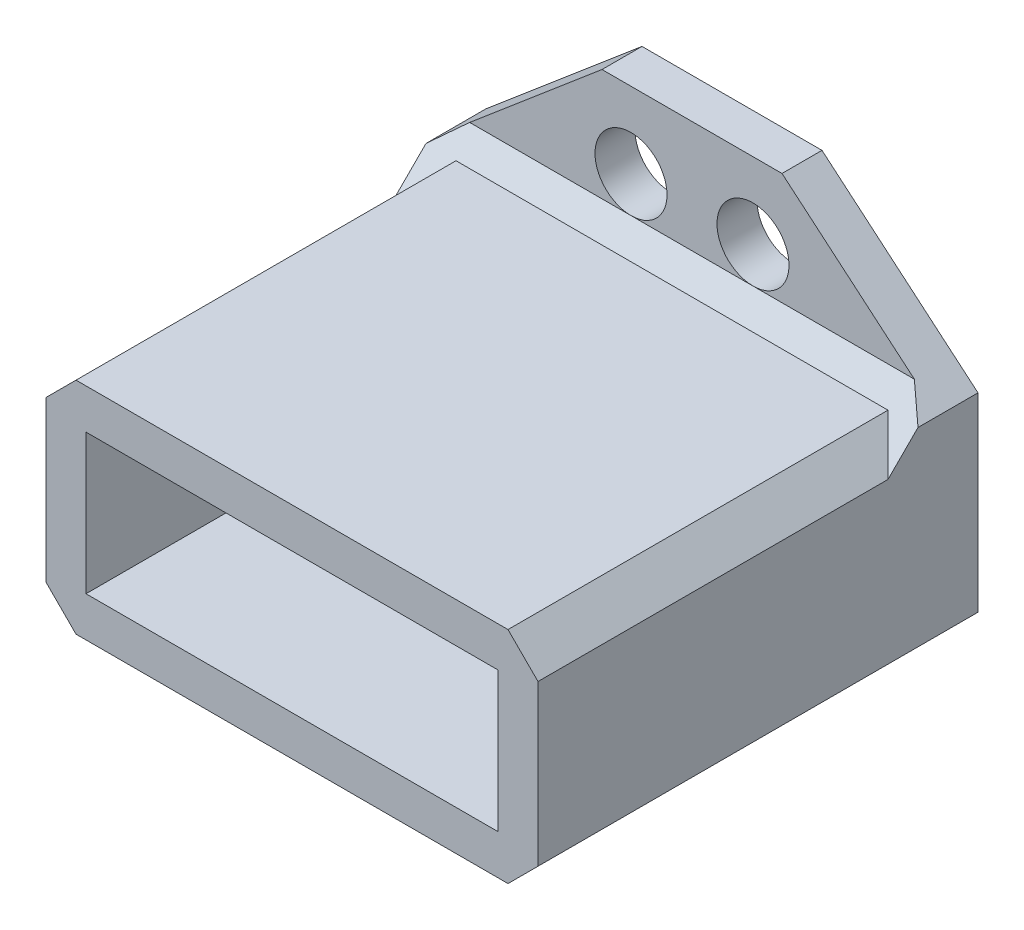
ISO-10303-21;
HEADER;
FILE_DESCRIPTION(('STEP AP214'),'2;1');
FILE_NAME('part.step','',(''),(''),'','','');
FILE_SCHEMA(('AUTOMOTIVE_DESIGN { 1 0 10303 214 1 1 1 1 }'));
ENDSEC;
DATA;
#1=APPLICATION_CONTEXT('core data for automotive mechanical design processes');
#2=APPLICATION_PROTOCOL_DEFINITION('international standard','automotive_design',2000,#1);
#3=PRODUCT_CONTEXT('',#1,'mechanical');
#4=PRODUCT('Part','Part','',(#3));
#5=PRODUCT_RELATED_PRODUCT_CATEGORY('part','',(#4));
#6=PRODUCT_DEFINITION_FORMATION('','',#4);
#7=PRODUCT_DEFINITION_CONTEXT('part definition',#1,'design');
#8=PRODUCT_DEFINITION('design','',#6,#7);
#9=PRODUCT_DEFINITION_SHAPE('','',#8);
#10=(LENGTH_UNIT() NAMED_UNIT(*) SI_UNIT(.MILLI.,.METRE.));
#11=(NAMED_UNIT(*) PLANE_ANGLE_UNIT() SI_UNIT($,.RADIAN.));
#12=(NAMED_UNIT(*) SI_UNIT($,.STERADIAN.) SOLID_ANGLE_UNIT());
#13=UNCERTAINTY_MEASURE_WITH_UNIT(LENGTH_MEASURE(1.E-05),#10,'distance_accuracy_value','');
#14=(GEOMETRIC_REPRESENTATION_CONTEXT(3) GLOBAL_UNCERTAINTY_ASSIGNED_CONTEXT((#13)) GLOBAL_UNIT_ASSIGNED_CONTEXT((#10,
#11,#12)) REPRESENTATION_CONTEXT('',''));
#15=CARTESIAN_POINT('',(0.,0.,0.));
#16=DIRECTION('',(0.,0.,1.));
#17=DIRECTION('',(1.,0.,0.));
#18=AXIS2_PLACEMENT_3D('',#15,#16,#17);
#19=CARTESIAN_POINT('',(-10.3,-3.5,10.));
#20=DIRECTION('',(0.,1.,0.));
#21=DIRECTION('',(-1.,0.,0.));
#22=AXIS2_PLACEMENT_3D('',#19,#20,#21);
#23=PLANE('',#22);
#24=DIRECTION('',(0.,0.,-1.));
#25=VECTOR('',#24,1.);
#26=CARTESIAN_POINT('',(10.3,-3.5,10.));
#27=LINE('',#26,#25);
#28=CARTESIAN_POINT('',(10.3,-3.5,10.));
#29=VERTEX_POINT('',#28);
#30=CARTESIAN_POINT('',(10.3,-3.5,-12.));
#31=VERTEX_POINT('',#30);
#32=EDGE_CURVE('E422',#29,#31,#27,.T.);
#33=ORIENTED_EDGE('',*,*,#32,.T.);
#34=DIRECTION('',(-1.,0.,0.));
#35=VECTOR('',#34,1.);
#36=CARTESIAN_POINT('',(10.3,-3.5,-12.));
#37=LINE('',#36,#35);
#38=CARTESIAN_POINT('',(-10.3,-3.5,-12.));
#39=VERTEX_POINT('',#38);
#40=EDGE_CURVE('E345',#31,#39,#37,.T.);
#41=ORIENTED_EDGE('',*,*,#40,.T.);
#42=DIRECTION('',(0.,0.,-1.));
#43=VECTOR('',#42,1.);
#44=CARTESIAN_POINT('',(-10.3,-3.5,10.));
#45=LINE('',#44,#43);
#46=CARTESIAN_POINT('',(-10.3,-3.5,10.));
#47=VERTEX_POINT('',#46);
#48=EDGE_CURVE('E425',#47,#39,#45,.T.);
#49=ORIENTED_EDGE('',*,*,#48,.F.);
#50=DIRECTION('',(1.,0.,0.));
#51=VECTOR('',#50,1.);
#52=CARTESIAN_POINT('',(-10.3,-3.5,10.));
#53=LINE('',#52,#51);
#54=EDGE_CURVE('E406',#47,#29,#53,.T.);
#55=ORIENTED_EDGE('',*,*,#54,.T.);
#56=EDGE_LOOP('',(#33,#41,#49,#55));
#57=FACE_BOUND('',#56,.T.);
#58=DIRECTION('',(1.,0.,0.));
#59=VECTOR('',#58,1.);
#60=CARTESIAN_POINT('',(-10.3,-3.5,-5.75));
#61=LINE('',#60,#59);
#62=CARTESIAN_POINT('',(-6.82679491924311,-3.5,-5.75));
#63=VERTEX_POINT('',#62);
#64=CARTESIAN_POINT('',(-3.17320520786901,-3.5,-5.75));
#65=VERTEX_POINT('',#64);
#66=EDGE_CURVE('E535',#63,#65,#61,.T.);
#67=ORIENTED_EDGE('',*,*,#66,.T.);
#68=DIRECTION('',(0.,0.,1.));
#69=VECTOR('',#68,1.);
#70=CARTESIAN_POINT('',(-3.17320520786901,-3.5,-3.75));
#71=LINE('',#70,#69);
#72=CARTESIAN_POINT('',(-3.17320520786901,-3.5,-0.749999999999999));
#73=VERTEX_POINT('',#72);
#74=EDGE_CURVE('E320',#65,#73,#71,.T.);
#75=ORIENTED_EDGE('',*,*,#74,.T.);
#76=DIRECTION('',(1.,0.,0.));
#77=VECTOR('',#76,1.);
#78=CARTESIAN_POINT('',(-6.82679491924311,-3.5,-0.749999999999999));
#79=LINE('',#78,#77);
#80=CARTESIAN_POINT('',(-6.82679491924311,-3.5,-0.749999999999999));
#81=VERTEX_POINT('',#80);
#82=EDGE_CURVE('E301',#81,#73,#79,.T.);
#83=ORIENTED_EDGE('',*,*,#82,.F.);
#84=DIRECTION('',(0.,0.,1.));
#85=VECTOR('',#84,1.);
#86=CARTESIAN_POINT('',(-6.82679491924311,-3.5,-3.75));
#87=LINE('',#86,#85);
#88=EDGE_CURVE('E297',#63,#81,#87,.T.);
#89=ORIENTED_EDGE('',*,*,#88,.F.);
#90=EDGE_LOOP('',(#67,#75,#83,#89));
#91=FACE_BOUND('',#90,.T.);
#92=DIRECTION('',(1.,0.,0.));
#93=VECTOR('',#92,1.);
#94=CARTESIAN_POINT('',(-10.3,-3.5,-5.75));
#95=LINE('',#94,#93);
#96=CARTESIAN_POINT('',(3.173205207869,-3.5,-5.75));
#97=VERTEX_POINT('',#96);
#98=CARTESIAN_POINT('',(6.826794792131,-3.5,-5.75));
#99=VERTEX_POINT('',#98);
#100=EDGE_CURVE('E539',#97,#99,#95,.T.);
#101=ORIENTED_EDGE('',*,*,#100,.T.);
#102=DIRECTION('',(0.,0.,1.));
#103=VECTOR('',#102,1.);
#104=CARTESIAN_POINT('',(6.826794792131,-3.5,-3.75));
#105=LINE('',#104,#103);
#106=CARTESIAN_POINT('',(6.826794792131,-3.5,-0.749999999999999));
#107=VERTEX_POINT('',#106);
#108=EDGE_CURVE('E991',#99,#107,#105,.T.);
#109=ORIENTED_EDGE('',*,*,#108,.T.);
#110=DIRECTION('',(1.,0.,0.));
#111=VECTOR('',#110,1.);
#112=CARTESIAN_POINT('',(3.173205207869,-3.5,-0.749999999999999));
#113=LINE('',#112,#111);
#114=CARTESIAN_POINT('',(3.173205207869,-3.5,-0.749999999999999));
#115=VERTEX_POINT('',#114);
#116=EDGE_CURVE('E267',#115,#107,#113,.T.);
#117=ORIENTED_EDGE('',*,*,#116,.F.);
#118=DIRECTION('',(0.,0.,1.));
#119=VECTOR('',#118,1.);
#120=CARTESIAN_POINT('',(3.173205207869,-3.5,-3.75));
#121=LINE('',#120,#119);
#122=EDGE_CURVE('E262',#97,#115,#121,.T.);
#123=ORIENTED_EDGE('',*,*,#122,.F.);
#124=EDGE_LOOP('',(#101,#109,#117,#123));
#125=FACE_BOUND('',#124,.T.);
#126=ADVANCED_FACE('F47',(#57,#91,#125),#23,.T.);
#127=CARTESIAN_POINT('',(-10.3,3.5,10.));
#128=DIRECTION('',(0.,-1.,0.));
#129=DIRECTION('',(0.,0.,-1.));
#130=AXIS2_PLACEMENT_3D('',#127,#128,#129);
#131=PLANE('',#130);
#132=DIRECTION('',(0.,0.,-1.));
#133=VECTOR('',#132,1.);
#134=CARTESIAN_POINT('',(-10.3,3.5,10.));
#135=LINE('',#134,#133);
#136=CARTESIAN_POINT('',(-10.3,3.5,10.));
#137=VERTEX_POINT('',#136);
#138=CARTESIAN_POINT('',(-10.3,3.5,-12.));
#139=VERTEX_POINT('',#138);
#140=EDGE_CURVE('E416',#137,#139,#135,.T.);
#141=ORIENTED_EDGE('',*,*,#140,.T.);
#142=DIRECTION('',(1.,0.,0.));
#143=VECTOR('',#142,1.);
#144=CARTESIAN_POINT('',(-10.3,3.5,-12.));
#145=LINE('',#144,#143);
#146=CARTESIAN_POINT('',(10.3,3.5,-12.));
#147=VERTEX_POINT('',#146);
#148=EDGE_CURVE('E353',#139,#147,#145,.T.);
#149=ORIENTED_EDGE('',*,*,#148,.T.);
#150=DIRECTION('',(0.,0.,-1.));
#151=VECTOR('',#150,1.);
#152=CARTESIAN_POINT('',(10.3,3.5,10.));
#153=LINE('',#152,#151);
#154=CARTESIAN_POINT('',(10.3,3.5,10.));
#155=VERTEX_POINT('',#154);
#156=EDGE_CURVE('E419',#155,#147,#153,.T.);
#157=ORIENTED_EDGE('',*,*,#156,.F.);
#158=DIRECTION('',(-1.,0.,0.));
#159=VECTOR('',#158,1.);
#160=CARTESIAN_POINT('',(-10.3,3.5,10.));
#161=LINE('',#160,#159);
#162=EDGE_CURVE('E413',#155,#137,#161,.T.);
#163=ORIENTED_EDGE('',*,*,#162,.T.);
#164=EDGE_LOOP('',(#141,#149,#157,#163));
#165=FACE_BOUND('',#164,.T.);
#166=DIRECTION('',(-1.,0.,0.));
#167=VECTOR('',#166,1.);
#168=CARTESIAN_POINT('',(-10.3,3.5,-5.75));
#169=LINE('',#168,#167);
#170=CARTESIAN_POINT('',(-3.17320520786901,3.5,-5.75));
#171=VERTEX_POINT('',#170);
#172=CARTESIAN_POINT('',(-6.82679491924311,3.5,-5.75));
#173=VERTEX_POINT('',#172);
#174=EDGE_CURVE('E523',#171,#173,#169,.T.);
#175=ORIENTED_EDGE('',*,*,#174,.T.);
#176=DIRECTION('',(0.,0.,1.));
#177=VECTOR('',#176,1.);
#178=CARTESIAN_POINT('',(-6.82679491924311,3.5,-3.75));
#179=LINE('',#178,#177);
#180=CARTESIAN_POINT('',(-6.82679491924311,3.5,-0.749999999999999));
#181=VERTEX_POINT('',#180);
#182=EDGE_CURVE('E312',#173,#181,#179,.T.);
#183=ORIENTED_EDGE('',*,*,#182,.T.);
#184=DIRECTION('',(-1.,0.,0.));
#185=VECTOR('',#184,1.);
#186=CARTESIAN_POINT('',(-6.82679491924311,3.5,-0.749999999999999));
#187=LINE('',#186,#185);
#188=CARTESIAN_POINT('',(-3.17320520786901,3.5,-0.749999999999999));
#189=VERTEX_POINT('',#188);
#190=EDGE_CURVE('E294',#189,#181,#187,.T.);
#191=ORIENTED_EDGE('',*,*,#190,.F.);
#192=DIRECTION('',(0.,0.,1.));
#193=VECTOR('',#192,1.);
#194=CARTESIAN_POINT('',(-3.17320520786901,3.5,-3.75));
#195=LINE('',#194,#193);
#196=EDGE_CURVE('E316',#171,#189,#195,.T.);
#197=ORIENTED_EDGE('',*,*,#196,.F.);
#198=EDGE_LOOP('',(#175,#183,#191,#197));
#199=FACE_BOUND('',#198,.T.);
#200=DIRECTION('',(-1.,0.,0.));
#201=VECTOR('',#200,1.);
#202=CARTESIAN_POINT('',(-10.3,3.5,-5.75));
#203=LINE('',#202,#201);
#204=CARTESIAN_POINT('',(6.826794792131,3.5,-5.75));
#205=VERTEX_POINT('',#204);
#206=CARTESIAN_POINT('',(3.173205207869,3.5,-5.75));
#207=VERTEX_POINT('',#206);
#208=EDGE_CURVE('E251',#205,#207,#203,.T.);
#209=ORIENTED_EDGE('',*,*,#208,.T.);
#210=DIRECTION('',(0.,0.,1.));
#211=VECTOR('',#210,1.);
#212=CARTESIAN_POINT('',(3.173205207869,3.5,-3.75));
#213=LINE('',#212,#211);
#214=CARTESIAN_POINT('',(3.173205207869,3.5,-0.749999999999999));
#215=VERTEX_POINT('',#214);
#216=EDGE_CURVE('E244',#207,#215,#213,.T.);
#217=ORIENTED_EDGE('',*,*,#216,.T.);
#218=DIRECTION('',(-1.,0.,0.));
#219=VECTOR('',#218,1.);
#220=CARTESIAN_POINT('',(3.173205207869,3.5,-0.749999999999999));
#221=LINE('',#220,#219);
#222=CARTESIAN_POINT('',(6.826794792131,3.5,-0.749999999999999));
#223=VERTEX_POINT('',#222);
#224=EDGE_CURVE('E248',#223,#215,#221,.T.);
#225=ORIENTED_EDGE('',*,*,#224,.F.);
#226=DIRECTION('',(0.,0.,1.));
#227=VECTOR('',#226,1.);
#228=CARTESIAN_POINT('',(6.826794792131,3.5,-3.75));
#229=LINE('',#228,#227);
#230=EDGE_CURVE('E255',#205,#223,#229,.T.);
#231=ORIENTED_EDGE('',*,*,#230,.F.);
#232=EDGE_LOOP('',(#209,#217,#225,#231));
#233=FACE_BOUND('',#232,.T.);
#234=ADVANCED_FACE('F246',(#165,#199,#233),#131,.T.);
#235=CARTESIAN_POINT('',(0.,0.,10.));
#236=DIRECTION('',(0.,0.,-1.));
#237=DIRECTION('',(-1.,0.,0.));
#238=AXIS2_PLACEMENT_3D('',#235,#236,#237);
#239=PLANE('',#238);
#240=DIRECTION('',(0.,-1.,0.));
#241=VECTOR('',#240,1.);
#242=CARTESIAN_POINT('',(-12.3,5.5,10.));
#243=LINE('',#242,#241);
#244=CARTESIAN_POINT('',(-12.3,3.99999999999999,10.));
#245=VERTEX_POINT('',#244);
#246=CARTESIAN_POINT('',(-12.3,-3.99999999999999,10.));
#247=VERTEX_POINT('',#246);
#248=EDGE_CURVE('E432',#245,#247,#243,.T.);
#249=ORIENTED_EDGE('',*,*,#248,.T.);
#250=DIRECTION('',(-0.707106781186548,0.707106781186548,0.));
#251=VECTOR('',#250,1.);
#252=CARTESIAN_POINT('',(-10.8,-5.5,10.));
#253=LINE('',#252,#251);
#254=CARTESIAN_POINT('',(-10.8,-5.5,10.));
#255=VERTEX_POINT('',#254);
#256=EDGE_CURVE('E496',#247,#255,#253,.F.);
#257=ORIENTED_EDGE('',*,*,#256,.T.);
#258=DIRECTION('',(1.,0.,0.));
#259=VECTOR('',#258,1.);
#260=CARTESIAN_POINT('',(-12.3,-5.5,10.));
#261=LINE('',#260,#259);
#262=CARTESIAN_POINT('',(10.8,-5.5,10.));
#263=VERTEX_POINT('',#262);
#264=EDGE_CURVE('E436',#255,#263,#261,.T.);
#265=ORIENTED_EDGE('',*,*,#264,.T.);
#266=DIRECTION('',(-0.707106781186548,-0.707106781186548,0.));
#267=VECTOR('',#266,1.);
#268=CARTESIAN_POINT('',(12.3,-3.99999999999999,10.));
#269=LINE('',#268,#267);
#270=CARTESIAN_POINT('',(12.3,-3.99999999999999,10.));
#271=VERTEX_POINT('',#270);
#272=EDGE_CURVE('E493',#263,#271,#269,.F.);
#273=ORIENTED_EDGE('',*,*,#272,.T.);
#274=DIRECTION('',(0.,1.,0.));
#275=VECTOR('',#274,1.);
#276=CARTESIAN_POINT('',(12.3,5.5,10.));
#277=LINE('',#276,#275);
#278=CARTESIAN_POINT('',(12.3,4.,10.));
#279=VERTEX_POINT('',#278);
#280=EDGE_CURVE('E440',#271,#279,#277,.T.);
#281=ORIENTED_EDGE('',*,*,#280,.T.);
#282=DIRECTION('',(0.707106781186547,-0.707106781186548,0.));
#283=VECTOR('',#282,1.);
#284=CARTESIAN_POINT('',(10.8,5.5,10.));
#285=LINE('',#284,#283);
#286=CARTESIAN_POINT('',(10.8,5.5,10.));
#287=VERTEX_POINT('',#286);
#288=EDGE_CURVE('E490',#279,#287,#285,.F.);
#289=ORIENTED_EDGE('',*,*,#288,.T.);
#290=DIRECTION('',(-1.,0.,0.));
#291=VECTOR('',#290,1.);
#292=CARTESIAN_POINT('',(-12.3,5.5,10.));
#293=LINE('',#292,#291);
#294=CARTESIAN_POINT('',(-10.8,5.5,10.));
#295=VERTEX_POINT('',#294);
#296=EDGE_CURVE('E428',#287,#295,#293,.T.);
#297=ORIENTED_EDGE('',*,*,#296,.T.);
#298=DIRECTION('',(0.707106781186548,0.707106781186548,0.));
#299=VECTOR('',#298,1.);
#300=CARTESIAN_POINT('',(-12.3,3.99999999999999,10.));
#301=LINE('',#300,#299);
#302=EDGE_CURVE('E487',#295,#245,#301,.F.);
#303=ORIENTED_EDGE('',*,*,#302,.T.);
#304=EDGE_LOOP('',(#249,#257,#265,#273,#281,#289,#297,#303));
#305=FACE_BOUND('',#304,.T.);
#306=DIRECTION('',(0.,-1.,0.));
#307=VECTOR('',#306,1.);
#308=CARTESIAN_POINT('',(-10.3,3.5,10.));
#309=LINE('',#308,#307);
#310=EDGE_CURVE('E403',#137,#47,#309,.T.);
#311=ORIENTED_EDGE('',*,*,#310,.F.);
#312=ORIENTED_EDGE('',*,*,#162,.F.);
#313=DIRECTION('',(0.,1.,0.));
#314=VECTOR('',#313,1.);
#315=CARTESIAN_POINT('',(10.3,3.5,10.));
#316=LINE('',#315,#314);
#317=EDGE_CURVE('E409',#29,#155,#316,.T.);
#318=ORIENTED_EDGE('',*,*,#317,.F.);
#319=ORIENTED_EDGE('',*,*,#54,.F.);
#320=EDGE_LOOP('',(#311,#312,#318,#319));
#321=FACE_BOUND('',#320,.T.);
#322=ADVANCED_FACE('F605',(#305,#321),#239,.F.);
#323=CARTESIAN_POINT('',(-12.3,5.5,10.));
#324=DIRECTION('',(0.,-1.,0.));
#325=DIRECTION('',(0.,0.,-1.));
#326=AXIS2_PLACEMENT_3D('',#323,#324,#325);
#327=PLANE('',#326);
#328=ORIENTED_EDGE('',*,*,#296,.F.);
#329=DIRECTION('',(0.,0.,-1.));
#330=VECTOR('',#329,1.);
#331=CARTESIAN_POINT('',(10.8,5.5,10.));
#332=LINE('',#331,#330);
#333=CARTESIAN_POINT('',(10.8,5.5,-8.99999999999999));
#334=VERTEX_POINT('',#333);
#335=EDGE_CURVE('E513',#287,#334,#332,.T.);
#336=ORIENTED_EDGE('',*,*,#335,.T.);
#337=DIRECTION('',(-1.,0.,0.));
#338=VECTOR('',#337,1.);
#339=CARTESIAN_POINT('',(-12.3,5.5,-8.99999999999999));
#340=LINE('',#339,#338);
#341=CARTESIAN_POINT('',(-10.8,5.5,-8.99999999999999));
#342=VERTEX_POINT('',#341);
#343=EDGE_CURVE('E444',#334,#342,#340,.T.);
#344=ORIENTED_EDGE('',*,*,#343,.T.);
#345=DIRECTION('',(0.,0.,1.));
#346=VECTOR('',#345,1.);
#347=CARTESIAN_POINT('',(-10.8,5.5,10.));
#348=LINE('',#347,#346);
#349=EDGE_CURVE('E510',#342,#295,#348,.T.);
#350=ORIENTED_EDGE('',*,*,#349,.T.);
#351=EDGE_LOOP('',(#328,#336,#344,#350));
#352=FACE_BOUND('',#351,.T.);
#353=ADVANCED_FACE('F618',(#352),#327,.F.);
#354=CARTESIAN_POINT('',(-12.3,5.5,10.));
#355=DIRECTION('',(1.,0.,0.));
#356=DIRECTION('',(0.,1.,0.));
#357=AXIS2_PLACEMENT_3D('',#354,#355,#356);
#358=PLANE('',#357);
#359=DIRECTION('',(0.,1.,0.));
#360=VECTOR('',#359,1.);
#361=CARTESIAN_POINT('',(-12.3,5.5,-12.));
#362=LINE('',#361,#360);
#363=CARTESIAN_POINT('',(-12.3,-3.99999999999999,-12.));
#364=VERTEX_POINT('',#363);
#365=CARTESIAN_POINT('',(-12.3,5.5,-12.));
#366=VERTEX_POINT('',#365);
#367=EDGE_CURVE('E362',#364,#366,#362,.T.);
#368=ORIENTED_EDGE('',*,*,#367,.F.);
#369=DIRECTION('',(0.,0.,1.));
#370=VECTOR('',#369,1.);
#371=CARTESIAN_POINT('',(-12.3,-3.99999999999999,10.));
#372=LINE('',#371,#370);
#373=EDGE_CURVE('E484',#364,#247,#372,.T.);
#374=ORIENTED_EDGE('',*,*,#373,.T.);
#375=ORIENTED_EDGE('',*,*,#248,.F.);
#376=DIRECTION('',(0.,0.,-1.));
#377=VECTOR('',#376,1.);
#378=CARTESIAN_POINT('',(-12.3,3.99999999999999,10.));
#379=LINE('',#378,#377);
#380=CARTESIAN_POINT('',(-12.3,3.99999999999999,-7.49999999999997));
#381=VERTEX_POINT('',#380);
#382=EDGE_CURVE('E480',#245,#381,#379,.T.);
#383=ORIENTED_EDGE('',*,*,#382,.T.);
#384=DIRECTION('',(0.,0.707106781186544,-0.707106781186551));
#385=VECTOR('',#384,1.);
#386=CARTESIAN_POINT('',(-12.3,-3.99999999999999,0.500000000000106));
#387=LINE('',#386,#385);
#388=CARTESIAN_POINT('',(-12.3,5.5,-8.99999999999999));
#389=VERTEX_POINT('',#388);
#390=EDGE_CURVE('E477',#381,#389,#387,.T.);
#391=ORIENTED_EDGE('',*,*,#390,.T.);
#392=DIRECTION('',(0.,0.,1.));
#393=VECTOR('',#392,1.);
#394=CARTESIAN_POINT('',(-12.3,5.5,-12.));
#395=LINE('',#394,#393);
#396=EDGE_CURVE('E399',#366,#389,#395,.T.);
#397=ORIENTED_EDGE('',*,*,#396,.F.);
#398=EDGE_LOOP('',(#368,#374,#375,#383,#391,#397));
#399=FACE_BOUND('',#398,.T.);
#400=ADVANCED_FACE('F626',(#399),#358,.F.);
#401=CARTESIAN_POINT('',(-12.3,-5.5,10.));
#402=DIRECTION('',(0.,1.,0.));
#403=DIRECTION('',(0.,0.,1.));
#404=AXIS2_PLACEMENT_3D('',#401,#402,#403);
#405=PLANE('',#404);
#406=ORIENTED_EDGE('',*,*,#264,.F.);
#407=DIRECTION('',(0.,0.,-1.));
#408=VECTOR('',#407,1.);
#409=CARTESIAN_POINT('',(-10.8,-5.5,10.));
#410=LINE('',#409,#408);
#411=CARTESIAN_POINT('',(-10.8,-5.5,-12.));
#412=VERTEX_POINT('',#411);
#413=EDGE_CURVE('E467',#255,#412,#410,.T.);
#414=ORIENTED_EDGE('',*,*,#413,.T.);
#415=DIRECTION('',(-1.,0.,0.));
#416=VECTOR('',#415,1.);
#417=CARTESIAN_POINT('',(-12.3,-5.5,-12.));
#418=LINE('',#417,#416);
#419=CARTESIAN_POINT('',(10.8,-5.5,-12.));
#420=VERTEX_POINT('',#419);
#421=EDGE_CURVE('E358',#420,#412,#418,.T.);
#422=ORIENTED_EDGE('',*,*,#421,.F.);
#423=DIRECTION('',(0.,0.,1.));
#424=VECTOR('',#423,1.);
#425=CARTESIAN_POINT('',(10.8,-5.5,10.));
#426=LINE('',#425,#424);
#427=EDGE_CURVE('E464',#420,#263,#426,.T.);
#428=ORIENTED_EDGE('',*,*,#427,.T.);
#429=EDGE_LOOP('',(#406,#414,#422,#428));
#430=FACE_BOUND('',#429,.T.);
#431=ADVANCED_FACE('F622',(#430),#405,.F.);
#432=CARTESIAN_POINT('',(12.3,5.5,10.));
#433=DIRECTION('',(-1.,0.,0.));
#434=DIRECTION('',(0.,-1.,0.));
#435=AXIS2_PLACEMENT_3D('',#432,#433,#434);
#436=PLANE('',#435);
#437=ORIENTED_EDGE('',*,*,#280,.F.);
#438=DIRECTION('',(0.,0.,-1.));
#439=VECTOR('',#438,1.);
#440=CARTESIAN_POINT('',(12.3,-3.99999999999999,10.));
#441=LINE('',#440,#439);
#442=CARTESIAN_POINT('',(12.3,-3.99999999999999,-12.));
#443=VERTEX_POINT('',#442);
#444=EDGE_CURVE('E506',#271,#443,#441,.T.);
#445=ORIENTED_EDGE('',*,*,#444,.T.);
#446=DIRECTION('',(0.,-1.,0.));
#447=VECTOR('',#446,1.);
#448=CARTESIAN_POINT('',(12.3,-5.5,-12.));
#449=LINE('',#448,#447);
#450=CARTESIAN_POINT('',(12.3,5.5,-12.));
#451=VERTEX_POINT('',#450);
#452=EDGE_CURVE('E375',#451,#443,#449,.T.);
#453=ORIENTED_EDGE('',*,*,#452,.F.);
#454=DIRECTION('',(0.,0.,1.));
#455=VECTOR('',#454,1.);
#456=CARTESIAN_POINT('',(12.3,5.5,-12.));
#457=LINE('',#456,#455);
#458=CARTESIAN_POINT('',(12.3,5.5,-8.99999999999999));
#459=VERTEX_POINT('',#458);
#460=EDGE_CURVE('E379',#451,#459,#457,.T.);
#461=ORIENTED_EDGE('',*,*,#460,.T.);
#462=DIRECTION('',(0.,-0.707106781186544,0.707106781186551));
#463=VECTOR('',#462,1.);
#464=CARTESIAN_POINT('',(12.3,-3.99999999999999,0.500000000000106));
#465=LINE('',#464,#463);
#466=CARTESIAN_POINT('',(12.3,4.,-7.49999999999997));
#467=VERTEX_POINT('',#466);
#468=EDGE_CURVE('E502',#459,#467,#465,.T.);
#469=ORIENTED_EDGE('',*,*,#468,.T.);
#470=DIRECTION('',(0.,0.,1.));
#471=VECTOR('',#470,1.);
#472=CARTESIAN_POINT('',(12.3,4.,10.));
#473=LINE('',#472,#471);
#474=EDGE_CURVE('E499',#467,#279,#473,.T.);
#475=ORIENTED_EDGE('',*,*,#474,.T.);
#476=EDGE_LOOP('',(#437,#445,#453,#461,#469,#475));
#477=FACE_BOUND('',#476,.T.);
#478=ADVANCED_FACE('F614',(#477),#436,.F.);
#479=CARTESIAN_POINT('',(-10.3,3.5,10.));
#480=DIRECTION('',(1.,0.,0.));
#481=DIRECTION('',(0.,0.,-1.));
#482=AXIS2_PLACEMENT_3D('',#479,#480,#481);
#483=PLANE('',#482);
#484=ORIENTED_EDGE('',*,*,#48,.T.);
#485=DIRECTION('',(0.,1.,0.));
#486=VECTOR('',#485,1.);
#487=CARTESIAN_POINT('',(-10.3,-3.5,-12.));
#488=LINE('',#487,#486);
#489=EDGE_CURVE('E349',#39,#139,#488,.T.);
#490=ORIENTED_EDGE('',*,*,#489,.T.);
#491=ORIENTED_EDGE('',*,*,#140,.F.);
#492=ORIENTED_EDGE('',*,*,#310,.T.);
#493=EDGE_LOOP('',(#484,#490,#491,#492));
#494=FACE_BOUND('',#493,.T.);
#495=ADVANCED_FACE('F611',(#494),#483,.T.);
#496=CARTESIAN_POINT('',(10.3,3.5,10.));
#497=DIRECTION('',(-1.,0.,0.));
#498=DIRECTION('',(0.,0.,1.));
#499=AXIS2_PLACEMENT_3D('',#496,#497,#498);
#500=PLANE('',#499);
#501=ORIENTED_EDGE('',*,*,#156,.T.);
#502=DIRECTION('',(0.,-1.,0.));
#503=VECTOR('',#502,1.);
#504=CARTESIAN_POINT('',(10.3,3.5,-12.));
#505=LINE('',#504,#503);
#506=EDGE_CURVE('E338',#147,#31,#505,.T.);
#507=ORIENTED_EDGE('',*,*,#506,.T.);
#508=ORIENTED_EDGE('',*,*,#32,.F.);
#509=ORIENTED_EDGE('',*,*,#317,.T.);
#510=EDGE_LOOP('',(#501,#507,#508,#509));
#511=FACE_BOUND('',#510,.T.);
#512=ADVANCED_FACE('F610',(#511),#500,.T.);
#513=CARTESIAN_POINT('',(0.,0.,-10.));
#514=DIRECTION('',(0.,0.,1.));
#515=DIRECTION('',(1.,0.,0.));
#516=AXIS2_PLACEMENT_3D('',#513,#514,#515);
#517=PLANE('',#516);
#518=DIRECTION('',(0.763386285369115,0.645942241466174,0.));
#519=VECTOR('',#518,1.);
#520=CARTESIAN_POINT('',(-12.3,5.5,-10.));
#521=LINE('',#520,#519);
#522=CARTESIAN_POINT('',(-11.1181818181818,6.5,-10.));
#523=VERTEX_POINT('',#522);
#524=CARTESIAN_POINT('',(-4.5,12.1,-10.));
#525=VERTEX_POINT('',#524);
#526=EDGE_CURVE('E357',#523,#525,#521,.T.);
#527=ORIENTED_EDGE('',*,*,#526,.F.);
#528=DIRECTION('',(1.,0.,0.));
#529=VECTOR('',#528,1.);
#530=CARTESIAN_POINT('',(0.,6.5,-10.));
#531=LINE('',#530,#529);
#532=CARTESIAN_POINT('',(-3.05,6.5,-10.));
#533=VERTEX_POINT('',#532);
#534=EDGE_CURVE('E454',#523,#533,#531,.T.);
#535=ORIENTED_EDGE('',*,*,#534,.T.);
#536=CARTESIAN_POINT('',(-3.05,8.3,-10.));
#537=DIRECTION('',(0.,0.,-1.));
#538=DIRECTION('',(1.,0.,0.));
#539=AXIS2_PLACEMENT_3D('',#536,#537,#538);
#540=CIRCLE('',#539,1.8);
#541=EDGE_CURVE('E315',#533,#533,#540,.T.);
#542=ORIENTED_EDGE('',*,*,#541,.T.);
#543=DIRECTION('',(1.,0.,0.));
#544=VECTOR('',#543,1.);
#545=CARTESIAN_POINT('',(0.,6.5,-10.));
#546=LINE('',#545,#544);
#547=CARTESIAN_POINT('',(3.05,6.5,-10.));
#548=VERTEX_POINT('',#547);
#549=EDGE_CURVE('E451',#533,#548,#546,.T.);
#550=ORIENTED_EDGE('',*,*,#549,.T.);
#551=CARTESIAN_POINT('',(3.05,8.3,-10.));
#552=DIRECTION('',(0.,0.,-1.));
#553=DIRECTION('',(-1.,0.,0.));
#554=AXIS2_PLACEMENT_3D('',#551,#552,#553);
#555=CIRCLE('',#554,1.8);
#556=EDGE_CURVE('E330',#548,#548,#555,.T.);
#557=ORIENTED_EDGE('',*,*,#556,.T.);
#558=DIRECTION('',(1.,0.,0.));
#559=VECTOR('',#558,1.);
#560=CARTESIAN_POINT('',(0.,6.5,-10.));
#561=LINE('',#560,#559);
#562=CARTESIAN_POINT('',(11.1181818181818,6.5,-10.));
#563=VERTEX_POINT('',#562);
#564=EDGE_CURVE('E448',#548,#563,#561,.T.);
#565=ORIENTED_EDGE('',*,*,#564,.T.);
#566=DIRECTION('',(0.763386285369115,-0.645942241466174,0.));
#567=VECTOR('',#566,1.);
#568=CARTESIAN_POINT('',(4.5,12.1,-10.));
#569=LINE('',#568,#567);
#570=CARTESIAN_POINT('',(4.5,12.1,-10.));
#571=VERTEX_POINT('',#570);
#572=EDGE_CURVE('E363',#571,#563,#569,.T.);
#573=ORIENTED_EDGE('',*,*,#572,.F.);
#574=DIRECTION('',(1.,0.,0.));
#575=VECTOR('',#574,1.);
#576=CARTESIAN_POINT('',(-4.5,12.1,-10.));
#577=LINE('',#576,#575);
#578=EDGE_CURVE('E382',#525,#571,#577,.T.);
#579=ORIENTED_EDGE('',*,*,#578,.F.);
#580=EDGE_LOOP('',(#527,#535,#542,#550,#557,#565,#573,#579));
#581=FACE_BOUND('',#580,.T.);
#582=ADVANCED_FACE('F864',(#581),#517,.T.);
#583=CARTESIAN_POINT('',(0.,0.,-12.));
#584=DIRECTION('',(0.,0.,1.));
#585=DIRECTION('',(1.,0.,0.));
#586=AXIS2_PLACEMENT_3D('',#583,#584,#585);
#587=PLANE('',#586);
#588=ORIENTED_EDGE('',*,*,#421,.T.);
#589=DIRECTION('',(0.707106781186548,-0.707106781186548,0.));
#590=VECTOR('',#589,1.);
#591=CARTESIAN_POINT('',(-10.8,-5.5,-12.));
#592=LINE('',#591,#590);
#593=EDGE_CURVE('E474',#412,#364,#592,.F.);
#594=ORIENTED_EDGE('',*,*,#593,.T.);
#595=ORIENTED_EDGE('',*,*,#367,.T.);
#596=DIRECTION('',(0.763386285369115,0.645942241466174,0.));
#597=VECTOR('',#596,1.);
#598=CARTESIAN_POINT('',(-12.3,5.5,-12.));
#599=LINE('',#598,#597);
#600=CARTESIAN_POINT('',(-4.5,12.1,-12.));
#601=VERTEX_POINT('',#600);
#602=EDGE_CURVE('E366',#366,#601,#599,.T.);
#603=ORIENTED_EDGE('',*,*,#602,.T.);
#604=DIRECTION('',(1.,0.,0.));
#605=VECTOR('',#604,1.);
#606=CARTESIAN_POINT('',(-4.5,12.1,-12.));
#607=LINE('',#606,#605);
#608=CARTESIAN_POINT('',(4.5,12.1,-12.));
#609=VERTEX_POINT('',#608);
#610=EDGE_CURVE('E369',#601,#609,#607,.T.);
#611=ORIENTED_EDGE('',*,*,#610,.T.);
#612=DIRECTION('',(0.763386285369115,-0.645942241466174,0.));
#613=VECTOR('',#612,1.);
#614=CARTESIAN_POINT('',(4.5,12.1,-12.));
#615=LINE('',#614,#613);
#616=EDGE_CURVE('E372',#609,#451,#615,.T.);
#617=ORIENTED_EDGE('',*,*,#616,.T.);
#618=ORIENTED_EDGE('',*,*,#452,.T.);
#619=DIRECTION('',(0.707106781186548,0.707106781186548,0.));
#620=VECTOR('',#619,1.);
#621=CARTESIAN_POINT('',(12.3,-3.99999999999999,-12.));
#622=LINE('',#621,#620);
#623=EDGE_CURVE('E471',#443,#420,#622,.F.);
#624=ORIENTED_EDGE('',*,*,#623,.T.);
#625=EDGE_LOOP('',(#588,#594,#595,#603,#611,#617,#618,#624));
#626=FACE_BOUND('',#625,.T.);
#627=ORIENTED_EDGE('',*,*,#506,.F.);
#628=ORIENTED_EDGE('',*,*,#148,.F.);
#629=ORIENTED_EDGE('',*,*,#489,.F.);
#630=ORIENTED_EDGE('',*,*,#40,.F.);
#631=EDGE_LOOP('',(#627,#628,#629,#630));
#632=FACE_BOUND('',#631,.T.);
#633=CARTESIAN_POINT('',(3.05,8.3,-12.));
#634=DIRECTION('',(0.,0.,-1.));
#635=DIRECTION('',(-1.,0.,0.));
#636=AXIS2_PLACEMENT_3D('',#633,#634,#635);
#637=CIRCLE('',#636,1.8);
#638=CARTESIAN_POINT('',(1.25,8.3,-12.));
#639=VERTEX_POINT('',#638);
#640=EDGE_CURVE('E334',#639,#639,#637,.T.);
#641=ORIENTED_EDGE('',*,*,#640,.F.);
#642=EDGE_LOOP('',(#641));
#643=FACE_BOUND('',#642,.T.);
#644=CARTESIAN_POINT('',(-3.05,8.3,-12.));
#645=DIRECTION('',(0.,0.,-1.));
#646=DIRECTION('',(1.,0.,0.));
#647=AXIS2_PLACEMENT_3D('',#644,#645,#646);
#648=CIRCLE('',#647,1.8);
#649=CARTESIAN_POINT('',(-1.25,8.3,-12.));
#650=VERTEX_POINT('',#649);
#651=EDGE_CURVE('E326',#650,#650,#648,.T.);
#652=ORIENTED_EDGE('',*,*,#651,.F.);
#653=EDGE_LOOP('',(#652));
#654=FACE_BOUND('',#653,.T.);
#655=ADVANCED_FACE('F855',(#626,#632,#643,#654),#587,.F.);
#656=CARTESIAN_POINT('',(-12.3,5.5,-12.));
#657=DIRECTION('',(0.645942241466174,-0.763386285369115,0.));
#658=DIRECTION('',(0.763386285369115,0.645942241466174,0.));
#659=AXIS2_PLACEMENT_3D('',#656,#657,#658);
#660=PLANE('',#659);
#661=ORIENTED_EDGE('',*,*,#396,.T.);
#662=DIRECTION('',(0.641242710767085,0.542589986033687,-0.542589986033693));
#663=VECTOR('',#662,1.);
#664=CARTESIAN_POINT('',(-11.256204379562,6.38321167883212,-9.88321167883212));
#665=LINE('',#664,#663);
#666=EDGE_CURVE('E457',#389,#523,#665,.T.);
#667=ORIENTED_EDGE('',*,*,#666,.T.);
#668=ORIENTED_EDGE('',*,*,#526,.T.);
#669=DIRECTION('',(0.,0.,1.));
#670=VECTOR('',#669,1.);
#671=CARTESIAN_POINT('',(-4.5,12.1,-12.));
#672=LINE('',#671,#670);
#673=EDGE_CURVE('E395',#601,#525,#672,.T.);
#674=ORIENTED_EDGE('',*,*,#673,.F.);
#675=ORIENTED_EDGE('',*,*,#602,.F.);
#676=EDGE_LOOP('',(#661,#667,#668,#674,#675));
#677=FACE_BOUND('',#676,.T.);
#678=ADVANCED_FACE('F844',(#677),#660,.F.);
#679=CARTESIAN_POINT('',(-4.5,12.1,-12.));
#680=DIRECTION('',(0.,-1.,0.));
#681=DIRECTION('',(0.,0.,-1.));
#682=AXIS2_PLACEMENT_3D('',#679,#680,#681);
#683=PLANE('',#682);
#684=ORIENTED_EDGE('',*,*,#578,.T.);
#685=DIRECTION('',(0.,0.,1.));
#686=VECTOR('',#685,1.);
#687=CARTESIAN_POINT('',(4.5,12.1,-12.));
#688=LINE('',#687,#686);
#689=EDGE_CURVE('E391',#609,#571,#688,.T.);
#690=ORIENTED_EDGE('',*,*,#689,.F.);
#691=ORIENTED_EDGE('',*,*,#610,.F.);
#692=ORIENTED_EDGE('',*,*,#673,.T.);
#693=EDGE_LOOP('',(#684,#690,#691,#692));
#694=FACE_BOUND('',#693,.T.);
#695=ADVANCED_FACE('F833',(#694),#683,.F.);
#696=CARTESIAN_POINT('',(4.5,12.1,-12.));
#697=DIRECTION('',(-0.645942241466174,-0.763386285369115,0.));
#698=DIRECTION('',(0.763386285369115,-0.645942241466174,0.));
#699=AXIS2_PLACEMENT_3D('',#696,#697,#698);
#700=PLANE('',#699);
#701=ORIENTED_EDGE('',*,*,#572,.T.);
#702=DIRECTION('',(0.641242710767085,-0.542589986033687,0.542589986033693));
#703=VECTOR('',#702,1.);
#704=CARTESIAN_POINT('',(5.75255474452557,11.0401459854014,-14.5401459854015));
#705=LINE('',#704,#703);
#706=EDGE_CURVE('E460',#563,#459,#705,.T.);
#707=ORIENTED_EDGE('',*,*,#706,.T.);
#708=ORIENTED_EDGE('',*,*,#460,.F.);
#709=ORIENTED_EDGE('',*,*,#616,.F.);
#710=ORIENTED_EDGE('',*,*,#689,.T.);
#711=EDGE_LOOP('',(#701,#707,#708,#709,#710));
#712=FACE_BOUND('',#711,.T.);
#713=ADVANCED_FACE('F823',(#712),#700,.F.);
#714=CARTESIAN_POINT('',(3.05,8.3,-12.));
#715=DIRECTION('',(0.,0.,1.));
#716=DIRECTION('',(1.,0.,0.));
#717=AXIS2_PLACEMENT_3D('',#714,#715,#716);
#718=CYLINDRICAL_SURFACE('',#717,1.8);
#719=ORIENTED_EDGE('',*,*,#640,.T.);
#720=EDGE_LOOP('',(#719));
#721=FACE_BOUND('',#720,.T.);
#722=ORIENTED_EDGE('',*,*,#556,.F.);
#723=EDGE_LOOP('',(#722));
#724=FACE_BOUND('',#723,.T.);
#725=ADVANCED_FACE('F813',(#721,#724),#718,.F.);
#726=CARTESIAN_POINT('',(-3.05,8.3,-12.));
#727=DIRECTION('',(0.,0.,1.));
#728=DIRECTION('',(1.,0.,0.));
#729=AXIS2_PLACEMENT_3D('',#726,#727,#728);
#730=CYLINDRICAL_SURFACE('',#729,1.8);
#731=ORIENTED_EDGE('',*,*,#651,.T.);
#732=EDGE_LOOP('',(#731));
#733=FACE_BOUND('',#732,.T.);
#734=ORIENTED_EDGE('',*,*,#541,.F.);
#735=EDGE_LOOP('',(#734));
#736=FACE_BOUND('',#735,.T.);
#737=ADVANCED_FACE('F642',(#733,#736),#730,.F.);
#738=CARTESIAN_POINT('',(-12.3,5.5,-8.99999999999999));
#739=DIRECTION('',(0.,-0.707106781186551,-0.707106781186544));
#740=DIRECTION('',(-1.,0.,0.));
#741=AXIS2_PLACEMENT_3D('',#738,#739,#740);
#742=PLANE('',#741);
#743=ORIENTED_EDGE('',*,*,#549,.F.);
#744=ORIENTED_EDGE('',*,*,#534,.F.);
#745=ORIENTED_EDGE('',*,*,#666,.F.);
#746=ORIENTED_EDGE('',*,*,#390,.F.);
#747=DIRECTION('',(-0.577350269189624,-0.577350269189624,0.57735026918963));
#748=VECTOR('',#747,1.);
#749=CARTESIAN_POINT('',(-11.3,5.,-8.49999999999998));
#750=LINE('',#749,#748);
#751=EDGE_CURVE('E520',#381,#342,#750,.F.);
#752=ORIENTED_EDGE('',*,*,#751,.T.);
#753=ORIENTED_EDGE('',*,*,#343,.F.);
#754=DIRECTION('',(-0.577350269189623,0.577350269189624,-0.57735026918963));
#755=VECTOR('',#754,1.);
#756=CARTESIAN_POINT('',(3.10000000000007,13.1999999999999,-16.7));
#757=LINE('',#756,#755);
#758=EDGE_CURVE('E517',#334,#467,#757,.F.);
#759=ORIENTED_EDGE('',*,*,#758,.T.);
#760=ORIENTED_EDGE('',*,*,#468,.F.);
#761=ORIENTED_EDGE('',*,*,#706,.F.);
#762=ORIENTED_EDGE('',*,*,#564,.F.);
#763=EDGE_LOOP('',(#743,#744,#745,#746,#752,#753,#759,#760,#761,#762));
#764=FACE_BOUND('',#763,.T.);
#765=ADVANCED_FACE('F635',(#764),#742,.F.);
#766=CARTESIAN_POINT('',(-10.8,-5.5,10.));
#767=DIRECTION('',(0.707106781186547,0.707106781186547,0.));
#768=DIRECTION('',(0.,0.,-1.));
#769=AXIS2_PLACEMENT_3D('',#766,#767,#768);
#770=PLANE('',#769);
#771=ORIENTED_EDGE('',*,*,#256,.F.);
#772=ORIENTED_EDGE('',*,*,#373,.F.);
#773=ORIENTED_EDGE('',*,*,#593,.F.);
#774=ORIENTED_EDGE('',*,*,#413,.F.);
#775=EDGE_LOOP('',(#771,#772,#773,#774));
#776=FACE_BOUND('',#775,.T.);
#777=ADVANCED_FACE('F641',(#776),#770,.F.);
#778=CARTESIAN_POINT('',(12.3,-3.99999999999999,10.));
#779=DIRECTION('',(-0.707106781186547,0.707106781186547,0.));
#780=DIRECTION('',(0.,0.,-1.));
#781=AXIS2_PLACEMENT_3D('',#778,#779,#780);
#782=PLANE('',#781);
#783=ORIENTED_EDGE('',*,*,#272,.F.);
#784=ORIENTED_EDGE('',*,*,#427,.F.);
#785=ORIENTED_EDGE('',*,*,#623,.F.);
#786=ORIENTED_EDGE('',*,*,#444,.F.);
#787=EDGE_LOOP('',(#783,#784,#785,#786));
#788=FACE_BOUND('',#787,.T.);
#789=ADVANCED_FACE('F649',(#788),#782,.F.);
#790=CARTESIAN_POINT('',(10.8,5.5,10.));
#791=DIRECTION('',(-0.707106781186548,-0.707106781186547,0.));
#792=DIRECTION('',(0.,0.,-1.));
#793=AXIS2_PLACEMENT_3D('',#790,#791,#792);
#794=PLANE('',#793);
#795=ORIENTED_EDGE('',*,*,#288,.F.);
#796=ORIENTED_EDGE('',*,*,#474,.F.);
#797=ORIENTED_EDGE('',*,*,#758,.F.);
#798=ORIENTED_EDGE('',*,*,#335,.F.);
#799=EDGE_LOOP('',(#795,#796,#797,#798));
#800=FACE_BOUND('',#799,.T.);
#801=ADVANCED_FACE('F656',(#800),#794,.F.);
#802=CARTESIAN_POINT('',(-12.3,3.99999999999999,10.));
#803=DIRECTION('',(0.707106781186547,-0.707106781186547,0.));
#804=DIRECTION('',(0.,0.,-1.));
#805=AXIS2_PLACEMENT_3D('',#802,#803,#804);
#806=PLANE('',#805);
#807=ORIENTED_EDGE('',*,*,#302,.F.);
#808=ORIENTED_EDGE('',*,*,#349,.F.);
#809=ORIENTED_EDGE('',*,*,#751,.F.);
#810=ORIENTED_EDGE('',*,*,#382,.F.);
#811=EDGE_LOOP('',(#807,#808,#809,#810));
#812=FACE_BOUND('',#811,.T.);
#813=ADVANCED_FACE('F663',(#812),#806,.F.);
#814=CARTESIAN_POINT('',(-6.82679491924311,3.5,-3.75));
#815=DIRECTION('',(-1.,0.,0.));
#816=DIRECTION('',(0.,-1.,0.));
#817=AXIS2_PLACEMENT_3D('',#814,#815,#816);
#818=PLANE('',#817);
#819=DIRECTION('',(0.,-1.,0.));
#820=VECTOR('',#819,1.);
#821=CARTESIAN_POINT('',(-6.82679491924311,3.5,-0.749999999999999));
#822=LINE('',#821,#820);
#823=EDGE_CURVE('E266',#181,#81,#822,.T.);
#824=ORIENTED_EDGE('',*,*,#823,.F.);
#825=ORIENTED_EDGE('',*,*,#182,.F.);
#826=CARTESIAN_POINT('',(-6.82679491924311,1.5,-5.75));
#827=DIRECTION('',(-1.,0.,0.));
#828=DIRECTION('',(0.,-1.,0.));
#829=AXIS2_PLACEMENT_3D('',#826,#827,#828);
#830=CIRCLE('',#829,2.);
#831=CARTESIAN_POINT('',(-6.82679491924311,1.5,-3.75));
#832=VERTEX_POINT('',#831);
#833=EDGE_CURVE('E561',#173,#832,#830,.F.);
#834=ORIENTED_EDGE('',*,*,#833,.T.);
#835=DIRECTION('',(0.,-1.,0.));
#836=VECTOR('',#835,1.);
#837=CARTESIAN_POINT('',(-6.82679491924311,3.5,-3.75));
#838=LINE('',#837,#836);
#839=CARTESIAN_POINT('',(-6.82679491924311,-1.5,-3.75));
#840=VERTEX_POINT('',#839);
#841=EDGE_CURVE('E289',#832,#840,#838,.T.);
#842=ORIENTED_EDGE('',*,*,#841,.T.);
#843=CARTESIAN_POINT('',(-6.82679491924311,-1.5,-5.75));
#844=DIRECTION('',(-1.,0.,0.));
#845=DIRECTION('',(0.,-1.,0.));
#846=AXIS2_PLACEMENT_3D('',#843,#844,#845);
#847=CIRCLE('',#846,2.);
#848=EDGE_CURVE('E11',#840,#63,#847,.F.);
#849=ORIENTED_EDGE('',*,*,#848,.T.);
#850=ORIENTED_EDGE('',*,*,#88,.T.);
#851=EDGE_LOOP('',(#824,#825,#834,#842,#849,#850));
#852=FACE_BOUND('',#851,.T.);
#853=ADVANCED_FACE('F586',(#852),#818,.T.);
#854=CARTESIAN_POINT('',(-3.17320520786901,3.5,-3.75));
#855=DIRECTION('',(1.,0.,0.));
#856=DIRECTION('',(0.,0.,-1.));
#857=AXIS2_PLACEMENT_3D('',#854,#855,#856);
#858=PLANE('',#857);
#859=DIRECTION('',(0.,1.,0.));
#860=VECTOR('',#859,1.);
#861=CARTESIAN_POINT('',(-3.17320520786901,3.5,-0.749999999999999));
#862=LINE('',#861,#860);
#863=EDGE_CURVE('E305',#73,#189,#862,.T.);
#864=ORIENTED_EDGE('',*,*,#863,.F.);
#865=ORIENTED_EDGE('',*,*,#74,.F.);
#866=CARTESIAN_POINT('',(-3.17320520786901,-1.5,-5.75));
#867=DIRECTION('',(1.,0.,0.));
#868=DIRECTION('',(0.,0.,-1.));
#869=AXIS2_PLACEMENT_3D('',#866,#867,#868);
#870=CIRCLE('',#869,2.);
#871=CARTESIAN_POINT('',(-3.17320520786901,-1.5,-3.75));
#872=VERTEX_POINT('',#871);
#873=EDGE_CURVE('E56',#65,#872,#870,.F.);
#874=ORIENTED_EDGE('',*,*,#873,.T.);
#875=DIRECTION('',(0.,1.,0.));
#876=VECTOR('',#875,1.);
#877=CARTESIAN_POINT('',(-3.17320520786901,3.5,-3.75));
#878=LINE('',#877,#876);
#879=CARTESIAN_POINT('',(-3.17320520786901,1.5,-3.75));
#880=VERTEX_POINT('',#879);
#881=EDGE_CURVE('E293',#872,#880,#878,.T.);
#882=ORIENTED_EDGE('',*,*,#881,.T.);
#883=CARTESIAN_POINT('',(-3.17320520786901,1.5,-5.75));
#884=DIRECTION('',(1.,0.,0.));
#885=DIRECTION('',(0.,0.,-1.));
#886=AXIS2_PLACEMENT_3D('',#883,#884,#885);
#887=CIRCLE('',#886,2.);
#888=EDGE_CURVE('E564',#880,#171,#887,.F.);
#889=ORIENTED_EDGE('',*,*,#888,.T.);
#890=ORIENTED_EDGE('',*,*,#196,.T.);
#891=EDGE_LOOP('',(#864,#865,#874,#882,#889,#890));
#892=FACE_BOUND('',#891,.T.);
#893=ADVANCED_FACE('F571',(#892),#858,.T.);
#894=CARTESIAN_POINT('',(0.,0.,-3.75));
#895=DIRECTION('',(0.,0.,1.));
#896=DIRECTION('',(1.,0.,0.));
#897=AXIS2_PLACEMENT_3D('',#894,#895,#896);
#898=PLANE('',#897);
#899=ORIENTED_EDGE('',*,*,#841,.F.);
#900=DIRECTION('',(-1.,0.,0.));
#901=VECTOR('',#900,1.);
#902=CARTESIAN_POINT('',(0.,1.5,-3.75));
#903=LINE('',#902,#901);
#904=EDGE_CURVE('E63',#832,#880,#903,.F.);
#905=ORIENTED_EDGE('',*,*,#904,.T.);
#906=ORIENTED_EDGE('',*,*,#881,.F.);
#907=DIRECTION('',(1.,0.,0.));
#908=VECTOR('',#907,1.);
#909=CARTESIAN_POINT('',(0.,-1.5,-3.75));
#910=LINE('',#909,#908);
#911=EDGE_CURVE('E543',#872,#840,#910,.F.);
#912=ORIENTED_EDGE('',*,*,#911,.T.);
#913=EDGE_LOOP('',(#899,#905,#906,#912));
#914=FACE_BOUND('',#913,.T.);
#915=ADVANCED_FACE('F587',(#914),#898,.F.);
#916=CARTESIAN_POINT('',(0.,0.,-0.749999999999999));
#917=DIRECTION('',(0.,0.,1.));
#918=DIRECTION('',(1.,0.,0.));
#919=AXIS2_PLACEMENT_3D('',#916,#917,#918);
#920=PLANE('',#919);
#921=ORIENTED_EDGE('',*,*,#823,.T.);
#922=ORIENTED_EDGE('',*,*,#82,.T.);
#923=ORIENTED_EDGE('',*,*,#863,.T.);
#924=ORIENTED_EDGE('',*,*,#190,.T.);
#925=EDGE_LOOP('',(#921,#922,#923,#924));
#926=FACE_BOUND('',#925,.T.);
#927=ADVANCED_FACE('F578',(#926),#920,.T.);
#928=CARTESIAN_POINT('',(3.173205207869,3.5,-3.75));
#929=DIRECTION('',(-1.,0.,0.));
#930=DIRECTION('',(0.,-1.,0.));
#931=AXIS2_PLACEMENT_3D('',#928,#929,#930);
#932=PLANE('',#931);
#933=DIRECTION('',(0.,-1.,0.));
#934=VECTOR('',#933,1.);
#935=CARTESIAN_POINT('',(3.173205207869,3.5,-0.749999999999999));
#936=LINE('',#935,#934);
#937=EDGE_CURVE('E259',#215,#115,#936,.T.);
#938=ORIENTED_EDGE('',*,*,#937,.F.);
#939=ORIENTED_EDGE('',*,*,#216,.F.);
#940=CARTESIAN_POINT('',(3.173205207869,1.5,-5.75));
#941=DIRECTION('',(-1.,0.,0.));
#942=DIRECTION('',(0.,-1.,0.));
#943=AXIS2_PLACEMENT_3D('',#940,#941,#942);
#944=CIRCLE('',#943,2.);
#945=CARTESIAN_POINT('',(3.173205207869,1.5,-3.75));
#946=VERTEX_POINT('',#945);
#947=EDGE_CURVE('E548',#207,#946,#944,.F.);
#948=ORIENTED_EDGE('',*,*,#947,.T.);
#949=DIRECTION('',(0.,-1.,0.));
#950=VECTOR('',#949,1.);
#951=CARTESIAN_POINT('',(3.173205207869,3.5,-3.75));
#952=LINE('',#951,#950);
#953=CARTESIAN_POINT('',(3.173205207869,-1.5,-3.75));
#954=VERTEX_POINT('',#953);
#955=EDGE_CURVE('E274',#946,#954,#952,.T.);
#956=ORIENTED_EDGE('',*,*,#955,.T.);
#957=CARTESIAN_POINT('',(3.173205207869,-1.5,-5.75));
#958=DIRECTION('',(-1.,0.,0.));
#959=DIRECTION('',(0.,-1.,0.));
#960=AXIS2_PLACEMENT_3D('',#957,#958,#959);
#961=CIRCLE('',#960,2.);
#962=EDGE_CURVE('E558',#954,#97,#961,.F.);
#963=ORIENTED_EDGE('',*,*,#962,.T.);
#964=ORIENTED_EDGE('',*,*,#122,.T.);
#965=EDGE_LOOP('',(#938,#939,#948,#956,#963,#964));
#966=FACE_BOUND('',#965,.T.);
#967=ADVANCED_FACE('F260',(#966),#932,.T.);
#968=CARTESIAN_POINT('',(6.826794792131,3.5,-3.75));
#969=DIRECTION('',(1.,0.,0.));
#970=DIRECTION('',(0.,1.,0.));
#971=AXIS2_PLACEMENT_3D('',#968,#969,#970);
#972=PLANE('',#971);
#973=DIRECTION('',(0.,1.,0.));
#974=VECTOR('',#973,1.);
#975=CARTESIAN_POINT('',(6.826794792131,3.5,-0.749999999999999));
#976=LINE('',#975,#974);
#977=EDGE_CURVE('E272',#107,#223,#976,.T.);
#978=ORIENTED_EDGE('',*,*,#977,.F.);
#979=ORIENTED_EDGE('',*,*,#108,.F.);
#980=CARTESIAN_POINT('',(6.826794792131,-1.5,-5.75));
#981=DIRECTION('',(1.,0.,0.));
#982=DIRECTION('',(0.,1.,0.));
#983=AXIS2_PLACEMENT_3D('',#980,#981,#982);
#984=CIRCLE('',#983,2.);
#985=CARTESIAN_POINT('',(6.826794792131,-1.5,-3.75));
#986=VERTEX_POINT('',#985);
#987=EDGE_CURVE('E555',#99,#986,#984,.F.);
#988=ORIENTED_EDGE('',*,*,#987,.T.);
#989=DIRECTION('',(0.,1.,0.));
#990=VECTOR('',#989,1.);
#991=CARTESIAN_POINT('',(6.826794792131,3.5,-3.75));
#992=LINE('',#991,#990);
#993=CARTESIAN_POINT('',(6.826794792131,1.5,-3.75));
#994=VERTEX_POINT('',#993);
#995=EDGE_CURVE('E280',#986,#994,#992,.T.);
#996=ORIENTED_EDGE('',*,*,#995,.T.);
#997=CARTESIAN_POINT('',(6.826794792131,1.5,-5.75));
#998=DIRECTION('',(1.,0.,0.));
#999=DIRECTION('',(0.,1.,0.));
#1000=AXIS2_PLACEMENT_3D('',#997,#998,#999);
#1001=CIRCLE('',#1000,2.);
#1002=EDGE_CURVE('E551',#994,#205,#1001,.F.);
#1003=ORIENTED_EDGE('',*,*,#1002,.T.);
#1004=ORIENTED_EDGE('',*,*,#230,.T.);
#1005=EDGE_LOOP('',(#978,#979,#988,#996,#1003,#1004));
#1006=FACE_BOUND('',#1005,.T.);
#1007=ADVANCED_FACE('F717',(#1006),#972,.T.);
#1008=CARTESIAN_POINT('',(0.,0.,-3.75));
#1009=DIRECTION('',(0.,0.,1.));
#1010=DIRECTION('',(1.,0.,0.));
#1011=AXIS2_PLACEMENT_3D('',#1008,#1009,#1010);
#1012=PLANE('',#1011);
#1013=ORIENTED_EDGE('',*,*,#955,.F.);
#1014=DIRECTION('',(-1.,0.,0.));
#1015=VECTOR('',#1014,1.);
#1016=CARTESIAN_POINT('',(0.,1.5,-3.75));
#1017=LINE('',#1016,#1015);
#1018=EDGE_CURVE('E532',#946,#994,#1017,.F.);
#1019=ORIENTED_EDGE('',*,*,#1018,.T.);
#1020=ORIENTED_EDGE('',*,*,#995,.F.);
#1021=DIRECTION('',(1.,0.,0.));
#1022=VECTOR('',#1021,1.);
#1023=CARTESIAN_POINT('',(0.,-1.5,-3.75));
#1024=LINE('',#1023,#1022);
#1025=EDGE_CURVE('E529',#986,#954,#1024,.F.);
#1026=ORIENTED_EDGE('',*,*,#1025,.T.);
#1027=EDGE_LOOP('',(#1013,#1019,#1020,#1026));
#1028=FACE_BOUND('',#1027,.T.);
#1029=ADVANCED_FACE('F709',(#1028),#1012,.F.);
#1030=CARTESIAN_POINT('',(0.,0.,-0.749999999999999));
#1031=DIRECTION('',(0.,0.,1.));
#1032=DIRECTION('',(1.,0.,0.));
#1033=AXIS2_PLACEMENT_3D('',#1030,#1031,#1032);
#1034=PLANE('',#1033);
#1035=ORIENTED_EDGE('',*,*,#937,.T.);
#1036=ORIENTED_EDGE('',*,*,#116,.T.);
#1037=ORIENTED_EDGE('',*,*,#977,.T.);
#1038=ORIENTED_EDGE('',*,*,#224,.T.);
#1039=EDGE_LOOP('',(#1035,#1036,#1037,#1038));
#1040=FACE_BOUND('',#1039,.T.);
#1041=ADVANCED_FACE('F270',(#1040),#1034,.T.);
#1042=CARTESIAN_POINT('',(-10.3,1.5,-5.75));
#1043=DIRECTION('',(-1.,0.,0.));
#1044=DIRECTION('',(0.,0.,1.));
#1045=AXIS2_PLACEMENT_3D('',#1042,#1043,#1044);
#1046=CYLINDRICAL_SURFACE('',#1045,2.);
#1047=ORIENTED_EDGE('',*,*,#1002,.F.);
#1048=ORIENTED_EDGE('',*,*,#1018,.F.);
#1049=ORIENTED_EDGE('',*,*,#947,.F.);
#1050=ORIENTED_EDGE('',*,*,#208,.F.);
#1051=EDGE_LOOP('',(#1047,#1048,#1049,#1050));
#1052=FACE_BOUND('',#1051,.T.);
#1053=ADVANCED_FACE('F670',(#1052),#1046,.F.);
#1054=CARTESIAN_POINT('',(-10.3,-1.5,-5.75));
#1055=DIRECTION('',(1.,0.,0.));
#1056=DIRECTION('',(0.,1.,0.));
#1057=AXIS2_PLACEMENT_3D('',#1054,#1055,#1056);
#1058=CYLINDRICAL_SURFACE('',#1057,2.);
#1059=ORIENTED_EDGE('',*,*,#962,.F.);
#1060=ORIENTED_EDGE('',*,*,#1025,.F.);
#1061=ORIENTED_EDGE('',*,*,#987,.F.);
#1062=ORIENTED_EDGE('',*,*,#100,.F.);
#1063=EDGE_LOOP('',(#1059,#1060,#1061,#1062));
#1064=FACE_BOUND('',#1063,.T.);
#1065=ADVANCED_FACE('F673',(#1064),#1058,.F.);
#1066=CARTESIAN_POINT('',(-10.3,1.5,-5.75));
#1067=DIRECTION('',(-1.,0.,0.));
#1068=DIRECTION('',(0.,0.,1.));
#1069=AXIS2_PLACEMENT_3D('',#1066,#1067,#1068);
#1070=CYLINDRICAL_SURFACE('',#1069,2.);
#1071=ORIENTED_EDGE('',*,*,#888,.F.);
#1072=ORIENTED_EDGE('',*,*,#904,.F.);
#1073=ORIENTED_EDGE('',*,*,#833,.F.);
#1074=ORIENTED_EDGE('',*,*,#174,.F.);
#1075=EDGE_LOOP('',(#1071,#1072,#1073,#1074));
#1076=FACE_BOUND('',#1075,.T.);
#1077=ADVANCED_FACE('F574',(#1076),#1070,.F.);
#1078=CARTESIAN_POINT('',(-10.3,-1.5,-5.75));
#1079=DIRECTION('',(1.,0.,0.));
#1080=DIRECTION('',(0.,1.,0.));
#1081=AXIS2_PLACEMENT_3D('',#1078,#1079,#1080);
#1082=CYLINDRICAL_SURFACE('',#1081,2.);
#1083=ORIENTED_EDGE('',*,*,#848,.F.);
#1084=ORIENTED_EDGE('',*,*,#911,.F.);
#1085=ORIENTED_EDGE('',*,*,#873,.F.);
#1086=ORIENTED_EDGE('',*,*,#66,.F.);
#1087=EDGE_LOOP('',(#1083,#1084,#1085,#1086));
#1088=FACE_BOUND('',#1087,.T.);
#1089=ADVANCED_FACE('F49',(#1088),#1082,.F.);
#1090=CLOSED_SHELL('',(#126,#234,#322,#353,#400,#431,#478,#495,#512,#582,#655,#678,#695,#713,
#725,#737,#765,#777,#789,#801,#813,#853,#893,#915,#927,#967,#1007,#1029,#1041,#1053,#1065,#1077,#1089));
#1091=MANIFOLD_SOLID_BREP('B2',#1090);
#1092=ADVANCED_BREP_SHAPE_REPRESENTATION('',(#18,#1091),#14);
#1093=SHAPE_DEFINITION_REPRESENTATION(#9,#1092);
ENDSEC;
END-ISO-10303-21;
